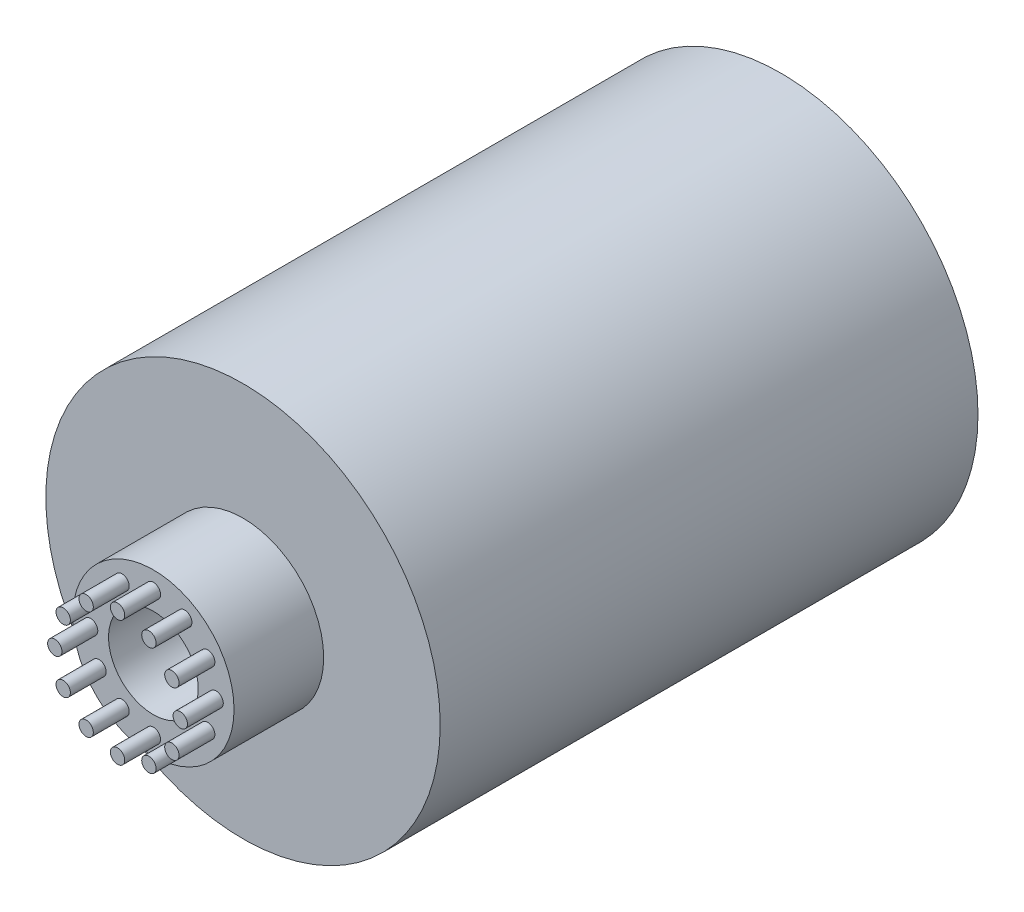
ISO-10303-21;
HEADER;
FILE_DESCRIPTION(('STEP AP214'),'2;1');
FILE_NAME('part.step','',(''),(''),'','','');
FILE_SCHEMA(('AUTOMOTIVE_DESIGN { 1 0 10303 214 1 1 1 1 }'));
ENDSEC;
DATA;
#1=APPLICATION_CONTEXT('core data for automotive mechanical design processes');
#2=APPLICATION_PROTOCOL_DEFINITION('international standard','automotive_design',2000,#1);
#3=PRODUCT_CONTEXT('',#1,'mechanical');
#4=PRODUCT('Part','Part','',(#3));
#5=PRODUCT_RELATED_PRODUCT_CATEGORY('part','',(#4));
#6=PRODUCT_DEFINITION_FORMATION('','',#4);
#7=PRODUCT_DEFINITION_CONTEXT('part definition',#1,'design');
#8=PRODUCT_DEFINITION('design','',#6,#7);
#9=PRODUCT_DEFINITION_SHAPE('','',#8);
#10=(LENGTH_UNIT() NAMED_UNIT(*) SI_UNIT(.MILLI.,.METRE.));
#11=(NAMED_UNIT(*) PLANE_ANGLE_UNIT() SI_UNIT($,.RADIAN.));
#12=(NAMED_UNIT(*) SI_UNIT($,.STERADIAN.) SOLID_ANGLE_UNIT());
#13=UNCERTAINTY_MEASURE_WITH_UNIT(LENGTH_MEASURE(1.E-05),#10,'distance_accuracy_value','');
#14=(GEOMETRIC_REPRESENTATION_CONTEXT(3) GLOBAL_UNCERTAINTY_ASSIGNED_CONTEXT((#13)) GLOBAL_UNIT_ASSIGNED_CONTEXT((#10,
#11,#12)) REPRESENTATION_CONTEXT('',''));
#15=CARTESIAN_POINT('',(0.,0.,0.));
#16=DIRECTION('',(0.,0.,1.));
#17=DIRECTION('',(1.,0.,0.));
#18=AXIS2_PLACEMENT_3D('',#15,#16,#17);
#19=CARTESIAN_POINT('',(0.,0.,30.));
#20=DIRECTION('',(0.,0.,-1.));
#21=DIRECTION('',(-1.,0.,0.));
#22=AXIS2_PLACEMENT_3D('',#19,#20,#21);
#23=CYLINDRICAL_SURFACE('',#22,11.);
#24=CARTESIAN_POINT('',(0.,0.,30.));
#25=DIRECTION('',(0.,0.,1.));
#26=DIRECTION('',(1.,0.,0.));
#27=AXIS2_PLACEMENT_3D('',#24,#25,#26);
#28=CIRCLE('',#27,11.);
#29=CARTESIAN_POINT('',(11.,0.,30.));
#30=VERTEX_POINT('',#29);
#31=EDGE_CURVE('E44',#30,#30,#28,.T.);
#32=ORIENTED_EDGE('',*,*,#31,.F.);
#33=EDGE_LOOP('',(#32));
#34=FACE_BOUND('',#33,.T.);
#35=CARTESIAN_POINT('',(0.,0.,0.));
#36=DIRECTION('',(0.,0.,1.));
#37=DIRECTION('',(1.,0.,0.));
#38=AXIS2_PLACEMENT_3D('',#35,#36,#37);
#39=CIRCLE('',#38,11.);
#40=CARTESIAN_POINT('',(11.,0.,0.));
#41=VERTEX_POINT('',#40);
#42=EDGE_CURVE('E35',#41,#41,#39,.T.);
#43=ORIENTED_EDGE('',*,*,#42,.T.);
#44=EDGE_LOOP('',(#43));
#45=FACE_BOUND('',#44,.T.);
#46=ADVANCED_FACE('F32',(#34,#45),#23,.T.);
#47=CARTESIAN_POINT('',(0.,0.,30.));
#48=DIRECTION('',(0.,0.,1.));
#49=DIRECTION('',(1.,0.,0.));
#50=AXIS2_PLACEMENT_3D('',#47,#48,#49);
#51=PLANE('',#50);
#52=CARTESIAN_POINT('',(0.,0.,30.));
#53=DIRECTION('',(0.,0.,1.));
#54=DIRECTION('',(1.,0.,0.));
#55=AXIS2_PLACEMENT_3D('',#52,#53,#54);
#56=CIRCLE('',#55,4.5);
#57=CARTESIAN_POINT('',(4.5,0.,30.));
#58=VERTEX_POINT('',#57);
#59=EDGE_CURVE('E39',#58,#58,#56,.T.);
#60=ORIENTED_EDGE('',*,*,#59,.F.);
#61=EDGE_LOOP('',(#60));
#62=FACE_BOUND('',#61,.T.);
#63=ORIENTED_EDGE('',*,*,#31,.T.);
#64=EDGE_LOOP('',(#63));
#65=FACE_BOUND('',#64,.T.);
#66=ADVANCED_FACE('F62',(#62,#65),#51,.T.);
#67=CARTESIAN_POINT('',(0.,0.,0.));
#68=DIRECTION('',(0.,0.,1.));
#69=DIRECTION('',(1.,0.,0.));
#70=AXIS2_PLACEMENT_3D('',#67,#68,#69);
#71=PLANE('',#70);
#72=CARTESIAN_POINT('',(0.,0.,0.));
#73=DIRECTION('',(0.,0.,-1.));
#74=DIRECTION('',(-1.,0.,0.));
#75=AXIS2_PLACEMENT_3D('',#72,#73,#74);
#76=CIRCLE('',#75,4.5);
#77=CARTESIAN_POINT('',(-4.5,0.,0.));
#78=VERTEX_POINT('',#77);
#79=EDGE_CURVE('E10',#78,#78,#76,.T.);
#80=ORIENTED_EDGE('',*,*,#79,.F.);
#81=EDGE_LOOP('',(#80));
#82=FACE_BOUND('',#81,.T.);
#83=ORIENTED_EDGE('',*,*,#42,.F.);
#84=EDGE_LOOP('',(#83));
#85=FACE_BOUND('',#84,.T.);
#86=ADVANCED_FACE('F59',(#82,#85),#71,.F.);
#87=CARTESIAN_POINT('',(0.,0.,35.));
#88=DIRECTION('',(0.,0.,-1.));
#89=DIRECTION('',(-1.,0.,0.));
#90=AXIS2_PLACEMENT_3D('',#87,#88,#89);
#91=CYLINDRICAL_SURFACE('',#90,4.5);
#92=CARTESIAN_POINT('',(0.,0.,35.));
#93=DIRECTION('',(0.,0.,1.));
#94=DIRECTION('',(1.,0.,0.));
#95=AXIS2_PLACEMENT_3D('',#92,#93,#94);
#96=CIRCLE('',#95,4.5);
#97=CARTESIAN_POINT('',(4.5,0.,35.));
#98=VERTEX_POINT('',#97);
#99=EDGE_CURVE('E50',#98,#98,#96,.T.);
#100=ORIENTED_EDGE('',*,*,#99,.F.);
#101=EDGE_LOOP('',(#100));
#102=FACE_BOUND('',#101,.T.);
#103=ORIENTED_EDGE('',*,*,#59,.T.);
#104=EDGE_LOOP('',(#103));
#105=FACE_BOUND('',#104,.T.);
#106=ADVANCED_FACE('F61',(#102,#105),#91,.T.);
#107=CARTESIAN_POINT('',(0.,0.,35.));
#108=DIRECTION('',(0.,0.,1.));
#109=DIRECTION('',(1.,0.,0.));
#110=AXIS2_PLACEMENT_3D('',#107,#108,#109);
#111=PLANE('',#110);
#112=CARTESIAN_POINT('',(1.74999999999996,3.03108891324556,35.));
#113=DIRECTION('',(0.,0.,1.));
#114=DIRECTION('',(0.866025403784445,-0.499999999999989,0.));
#115=AXIS2_PLACEMENT_3D('',#112,#113,#114);
#116=CIRCLE('',#115,0.4);
#117=CARTESIAN_POINT('',(2.09641016151374,2.83108891324556,35.));
#118=VERTEX_POINT('',#117);
#119=EDGE_CURVE('E392',#118,#118,#116,.T.);
#120=ORIENTED_EDGE('',*,*,#119,.F.);
#121=EDGE_LOOP('',(#120));
#122=FACE_BOUND('',#121,.T.);
#123=CARTESIAN_POINT('',(3.03108891324552,1.75000000000004,35.));
#124=DIRECTION('',(0.,0.,1.));
#125=DIRECTION('',(0.50000000000001,-0.866025403784433,0.));
#126=AXIS2_PLACEMENT_3D('',#123,#124,#125);
#127=CIRCLE('',#126,0.4);
#128=CARTESIAN_POINT('',(3.23108891324552,1.40358983848626,35.));
#129=VERTEX_POINT('',#128);
#130=EDGE_CURVE('E391',#129,#129,#127,.T.);
#131=ORIENTED_EDGE('',*,*,#130,.F.);
#132=EDGE_LOOP('',(#131));
#133=FACE_BOUND('',#132,.T.);
#134=CARTESIAN_POINT('',(3.5,0.,35.));
#135=DIRECTION('',(0.,0.,1.));
#136=DIRECTION('',(0.,-1.,0.));
#137=AXIS2_PLACEMENT_3D('',#134,#135,#136);
#138=CIRCLE('',#137,0.4);
#139=CARTESIAN_POINT('',(3.5,-0.399999999999963,35.));
#140=VERTEX_POINT('',#139);
#141=EDGE_CURVE('E401',#140,#140,#138,.T.);
#142=ORIENTED_EDGE('',*,*,#141,.F.);
#143=EDGE_LOOP('',(#142));
#144=FACE_BOUND('',#143,.T.);
#145=CARTESIAN_POINT('',(3.03108891324555,-1.74999999999997,35.));
#146=DIRECTION('',(0.,0.,1.));
#147=DIRECTION('',(-0.499999999999992,-0.866025403784443,0.));
#148=AXIS2_PLACEMENT_3D('',#145,#146,#147);
#149=CIRCLE('',#148,0.4);
#150=CARTESIAN_POINT('',(2.83108891324555,-2.09641016151375,35.));
#151=VERTEX_POINT('',#150);
#152=EDGE_CURVE('E406',#151,#151,#149,.T.);
#153=ORIENTED_EDGE('',*,*,#152,.F.);
#154=EDGE_LOOP('',(#153));
#155=FACE_BOUND('',#154,.T.);
#156=CARTESIAN_POINT('',(1.75000000000002,-3.03108891324552,35.));
#157=DIRECTION('',(0.,0.,1.));
#158=DIRECTION('',(-0.866025403784435,-0.500000000000007,0.));
#159=AXIS2_PLACEMENT_3D('',#156,#157,#158);
#160=CIRCLE('',#159,0.4);
#161=CARTESIAN_POINT('',(1.40358983848625,-3.23108891324552,35.));
#162=VERTEX_POINT('',#161);
#163=EDGE_CURVE('E412',#162,#162,#160,.T.);
#164=ORIENTED_EDGE('',*,*,#163,.F.);
#165=EDGE_LOOP('',(#164));
#166=FACE_BOUND('',#165,.T.);
#167=CARTESIAN_POINT('',(0.,-3.5,35.));
#168=DIRECTION('',(0.,0.,1.));
#169=DIRECTION('',(-1.,0.,0.));
#170=AXIS2_PLACEMENT_3D('',#167,#168,#169);
#171=CIRCLE('',#170,0.4);
#172=CARTESIAN_POINT('',(-0.4,-3.5,35.));
#173=VERTEX_POINT('',#172);
#174=EDGE_CURVE('E418',#173,#173,#171,.T.);
#175=ORIENTED_EDGE('',*,*,#174,.F.);
#176=EDGE_LOOP('',(#175));
#177=FACE_BOUND('',#176,.T.);
#178=CARTESIAN_POINT('',(-1.74999999999998,-3.03108891324555,35.));
#179=DIRECTION('',(0.,0.,1.));
#180=DIRECTION('',(-0.866025403784442,0.499999999999995,0.));
#181=AXIS2_PLACEMENT_3D('',#178,#179,#180);
#182=CIRCLE('',#181,0.4);
#183=CARTESIAN_POINT('',(-2.09641016151376,-2.83108891324555,35.));
#184=VERTEX_POINT('',#183);
#185=EDGE_CURVE('E424',#184,#184,#182,.T.);
#186=ORIENTED_EDGE('',*,*,#185,.F.);
#187=EDGE_LOOP('',(#186));
#188=FACE_BOUND('',#187,.T.);
#189=CARTESIAN_POINT('',(-3.03108891324553,-1.75000000000001,35.));
#190=DIRECTION('',(0.,0.,1.));
#191=DIRECTION('',(-0.500000000000004,0.866025403784436,0.));
#192=AXIS2_PLACEMENT_3D('',#189,#190,#191);
#193=CIRCLE('',#192,0.4);
#194=CARTESIAN_POINT('',(-3.23108891324553,-1.40358983848624,35.));
#195=VERTEX_POINT('',#194);
#196=EDGE_CURVE('E430',#195,#195,#193,.T.);
#197=ORIENTED_EDGE('',*,*,#196,.F.);
#198=EDGE_LOOP('',(#197));
#199=FACE_BOUND('',#198,.T.);
#200=CARTESIAN_POINT('',(-3.5,0.,35.));
#201=DIRECTION('',(0.,0.,1.));
#202=DIRECTION('',(0.,1.,0.));
#203=AXIS2_PLACEMENT_3D('',#200,#201,#202);
#204=CIRCLE('',#203,0.4);
#205=CARTESIAN_POINT('',(-3.5,0.399999999999988,35.));
#206=VERTEX_POINT('',#205);
#207=EDGE_CURVE('E436',#206,#206,#204,.T.);
#208=ORIENTED_EDGE('',*,*,#207,.F.);
#209=EDGE_LOOP('',(#208));
#210=FACE_BOUND('',#209,.T.);
#211=CARTESIAN_POINT('',(-3.03108891324554,1.74999999999999,35.));
#212=DIRECTION('',(0.,0.,1.));
#213=DIRECTION('',(0.499999999999998,0.86602540378444,0.));
#214=AXIS2_PLACEMENT_3D('',#211,#212,#213);
#215=CIRCLE('',#214,0.4);
#216=CARTESIAN_POINT('',(-2.83108891324554,2.09641016151377,35.));
#217=VERTEX_POINT('',#216);
#218=EDGE_CURVE('E442',#217,#217,#215,.T.);
#219=ORIENTED_EDGE('',*,*,#218,.F.);
#220=EDGE_LOOP('',(#219));
#221=FACE_BOUND('',#220,.T.);
#222=CARTESIAN_POINT('',(-1.75,3.03108891324553,35.));
#223=DIRECTION('',(0.,0.,1.));
#224=DIRECTION('',(0.866025403784438,0.500000000000001,0.));
#225=AXIS2_PLACEMENT_3D('',#222,#223,#224);
#226=CIRCLE('',#225,0.4);
#227=CARTESIAN_POINT('',(-1.40358983848623,3.23108891324553,35.));
#228=VERTEX_POINT('',#227);
#229=EDGE_CURVE('E448',#228,#228,#226,.T.);
#230=ORIENTED_EDGE('',*,*,#229,.F.);
#231=EDGE_LOOP('',(#230));
#232=FACE_BOUND('',#231,.T.);
#233=CARTESIAN_POINT('',(0.,3.5,35.));
#234=DIRECTION('',(0.,0.,1.));
#235=DIRECTION('',(1.,0.,0.));
#236=AXIS2_PLACEMENT_3D('',#233,#234,#235);
#237=CIRCLE('',#236,0.4);
#238=CARTESIAN_POINT('',(0.4,3.5,35.));
#239=VERTEX_POINT('',#238);
#240=EDGE_CURVE('E454',#239,#239,#237,.T.);
#241=ORIENTED_EDGE('',*,*,#240,.F.);
#242=EDGE_LOOP('',(#241));
#243=FACE_BOUND('',#242,.T.);
#244=CARTESIAN_POINT('',(0.,0.,35.));
#245=DIRECTION('',(0.,0.,1.));
#246=DIRECTION('',(1.,0.,0.));
#247=AXIS2_PLACEMENT_3D('',#244,#245,#246);
#248=CIRCLE('',#247,2.5);
#249=CARTESIAN_POINT('',(2.5,0.,35.));
#250=VERTEX_POINT('',#249);
#251=EDGE_CURVE('E460',#250,#250,#248,.T.);
#252=ORIENTED_EDGE('',*,*,#251,.F.);
#253=EDGE_LOOP('',(#252));
#254=FACE_BOUND('',#253,.T.);
#255=ORIENTED_EDGE('',*,*,#99,.T.);
#256=EDGE_LOOP('',(#255));
#257=FACE_BOUND('',#256,.T.);
#258=ADVANCED_FACE('F68',(#122,#133,#144,#155,#166,#177,#188,#199,#210,#221,#232,#243,#254,
#257),#111,.T.);
#259=CARTESIAN_POINT('',(0.,0.,-4.));
#260=DIRECTION('',(0.,0.,1.));
#261=DIRECTION('',(1.,0.,0.));
#262=AXIS2_PLACEMENT_3D('',#259,#260,#261);
#263=CYLINDRICAL_SURFACE('',#262,4.5);
#264=CARTESIAN_POINT('',(0.,0.,-4.));
#265=DIRECTION('',(0.,0.,-1.));
#266=DIRECTION('',(-1.,0.,0.));
#267=AXIS2_PLACEMENT_3D('',#264,#265,#266);
#268=CIRCLE('',#267,4.5);
#269=CARTESIAN_POINT('',(-4.5,0.,-4.));
#270=VERTEX_POINT('',#269);
#271=EDGE_CURVE('E48',#270,#270,#268,.T.);
#272=ORIENTED_EDGE('',*,*,#271,.F.);
#273=EDGE_LOOP('',(#272));
#274=FACE_BOUND('',#273,.T.);
#275=ORIENTED_EDGE('',*,*,#79,.T.);
#276=EDGE_LOOP('',(#275));
#277=FACE_BOUND('',#276,.T.);
#278=ADVANCED_FACE('F91',(#274,#277),#263,.T.);
#279=CARTESIAN_POINT('',(0.,0.,-4.));
#280=DIRECTION('',(0.,0.,-1.));
#281=DIRECTION('',(-1.,0.,0.));
#282=AXIS2_PLACEMENT_3D('',#279,#280,#281);
#283=PLANE('',#282);
#284=CARTESIAN_POINT('',(0.,0.,-4.));
#285=DIRECTION('',(0.,0.,1.));
#286=DIRECTION('',(1.,0.,0.));
#287=AXIS2_PLACEMENT_3D('',#284,#285,#286);
#288=CIRCLE('',#287,2.5);
#289=CARTESIAN_POINT('',(2.5,0.,-4.));
#290=VERTEX_POINT('',#289);
#291=EDGE_CURVE('E463',#290,#290,#288,.T.);
#292=ORIENTED_EDGE('',*,*,#291,.T.);
#293=EDGE_LOOP('',(#292));
#294=FACE_BOUND('',#293,.T.);
#295=ORIENTED_EDGE('',*,*,#271,.T.);
#296=EDGE_LOOP('',(#295));
#297=FACE_BOUND('',#296,.T.);
#298=ADVANCED_FACE('F112',(#294,#297),#283,.T.);
#299=CARTESIAN_POINT('',(0.,0.,-4.));
#300=DIRECTION('',(0.,0.,1.));
#301=DIRECTION('',(1.,0.,0.));
#302=AXIS2_PLACEMENT_3D('',#299,#300,#301);
#303=CYLINDRICAL_SURFACE('',#302,2.5);
#304=ORIENTED_EDGE('',*,*,#291,.F.);
#305=EDGE_LOOP('',(#304));
#306=FACE_BOUND('',#305,.T.);
#307=ORIENTED_EDGE('',*,*,#251,.T.);
#308=EDGE_LOOP('',(#307));
#309=FACE_BOUND('',#308,.T.);
#310=ADVANCED_FACE('F106',(#306,#309),#303,.F.);
#311=CARTESIAN_POINT('',(0.,3.5,37.));
#312=DIRECTION('',(0.,0.,-1.));
#313=DIRECTION('',(-1.,0.,0.));
#314=AXIS2_PLACEMENT_3D('',#311,#312,#313);
#315=CYLINDRICAL_SURFACE('',#314,0.4);
#316=CARTESIAN_POINT('',(0.,3.5,37.));
#317=DIRECTION('',(0.,0.,1.));
#318=DIRECTION('',(1.,0.,0.));
#319=AXIS2_PLACEMENT_3D('',#316,#317,#318);
#320=CIRCLE('',#319,0.4);
#321=CARTESIAN_POINT('',(0.4,3.5,37.));
#322=VERTEX_POINT('',#321);
#323=EDGE_CURVE('E457',#322,#322,#320,.T.);
#324=ORIENTED_EDGE('',*,*,#323,.F.);
#325=EDGE_LOOP('',(#324));
#326=FACE_BOUND('',#325,.T.);
#327=ORIENTED_EDGE('',*,*,#240,.T.);
#328=EDGE_LOOP('',(#327));
#329=FACE_BOUND('',#328,.T.);
#330=ADVANCED_FACE('F111',(#326,#329),#315,.T.);
#331=CARTESIAN_POINT('',(0.,3.5,37.));
#332=DIRECTION('',(0.,0.,1.));
#333=DIRECTION('',(1.,0.,0.));
#334=AXIS2_PLACEMENT_3D('',#331,#332,#333);
#335=PLANE('',#334);
#336=ORIENTED_EDGE('',*,*,#323,.T.);
#337=EDGE_LOOP('',(#336));
#338=FACE_BOUND('',#337,.T.);
#339=ADVANCED_FACE('F157',(#338),#335,.T.);
#340=CARTESIAN_POINT('',(-1.75,3.03108891324553,37.));
#341=DIRECTION('',(0.,0.,-1.));
#342=DIRECTION('',(-1.,0.,0.));
#343=AXIS2_PLACEMENT_3D('',#340,#341,#342);
#344=CYLINDRICAL_SURFACE('',#343,0.4);
#345=CARTESIAN_POINT('',(-1.75,3.03108891324553,37.));
#346=DIRECTION('',(0.,0.,1.));
#347=DIRECTION('',(0.866025403784438,0.500000000000001,0.));
#348=AXIS2_PLACEMENT_3D('',#345,#346,#347);
#349=CIRCLE('',#348,0.4);
#350=CARTESIAN_POINT('',(-1.40358983848623,3.23108891324553,37.));
#351=VERTEX_POINT('',#350);
#352=EDGE_CURVE('E451',#351,#351,#349,.T.);
#353=ORIENTED_EDGE('',*,*,#352,.F.);
#354=EDGE_LOOP('',(#353));
#355=FACE_BOUND('',#354,.T.);
#356=ORIENTED_EDGE('',*,*,#229,.T.);
#357=EDGE_LOOP('',(#356));
#358=FACE_BOUND('',#357,.T.);
#359=ADVANCED_FACE('F165',(#355,#358),#344,.T.);
#360=CARTESIAN_POINT('',(-1.75,3.03108891324553,37.));
#361=DIRECTION('',(0.,0.,1.));
#362=DIRECTION('',(0.866025403784438,0.500000000000001,0.));
#363=AXIS2_PLACEMENT_3D('',#360,#361,#362);
#364=PLANE('',#363);
#365=ORIENTED_EDGE('',*,*,#352,.T.);
#366=EDGE_LOOP('',(#365));
#367=FACE_BOUND('',#366,.T.);
#368=ADVANCED_FACE('F173',(#367),#364,.T.);
#369=CARTESIAN_POINT('',(-3.03108891324554,1.74999999999999,37.));
#370=DIRECTION('',(0.,0.,-1.));
#371=DIRECTION('',(-1.,0.,0.));
#372=AXIS2_PLACEMENT_3D('',#369,#370,#371);
#373=CYLINDRICAL_SURFACE('',#372,0.4);
#374=CARTESIAN_POINT('',(-3.03108891324554,1.74999999999999,37.));
#375=DIRECTION('',(0.,0.,1.));
#376=DIRECTION('',(0.499999999999998,0.86602540378444,0.));
#377=AXIS2_PLACEMENT_3D('',#374,#375,#376);
#378=CIRCLE('',#377,0.4);
#379=CARTESIAN_POINT('',(-2.83108891324554,2.09641016151377,37.));
#380=VERTEX_POINT('',#379);
#381=EDGE_CURVE('E445',#380,#380,#378,.T.);
#382=ORIENTED_EDGE('',*,*,#381,.F.);
#383=EDGE_LOOP('',(#382));
#384=FACE_BOUND('',#383,.T.);
#385=ORIENTED_EDGE('',*,*,#218,.T.);
#386=EDGE_LOOP('',(#385));
#387=FACE_BOUND('',#386,.T.);
#388=ADVANCED_FACE('F182',(#384,#387),#373,.T.);
#389=CARTESIAN_POINT('',(-3.03108891324554,1.74999999999999,37.));
#390=DIRECTION('',(0.,0.,1.));
#391=DIRECTION('',(0.499999999999998,0.86602540378444,0.));
#392=AXIS2_PLACEMENT_3D('',#389,#390,#391);
#393=PLANE('',#392);
#394=ORIENTED_EDGE('',*,*,#381,.T.);
#395=EDGE_LOOP('',(#394));
#396=FACE_BOUND('',#395,.T.);
#397=ADVANCED_FACE('F191',(#396),#393,.T.);
#398=CARTESIAN_POINT('',(-3.5,0.,37.));
#399=DIRECTION('',(0.,0.,-1.));
#400=DIRECTION('',(-1.,0.,0.));
#401=AXIS2_PLACEMENT_3D('',#398,#399,#400);
#402=CYLINDRICAL_SURFACE('',#401,0.4);
#403=CARTESIAN_POINT('',(-3.5,0.,37.));
#404=DIRECTION('',(0.,0.,1.));
#405=DIRECTION('',(0.,1.,0.));
#406=AXIS2_PLACEMENT_3D('',#403,#404,#405);
#407=CIRCLE('',#406,0.4);
#408=CARTESIAN_POINT('',(-3.5,0.399999999999988,37.));
#409=VERTEX_POINT('',#408);
#410=EDGE_CURVE('E439',#409,#409,#407,.T.);
#411=ORIENTED_EDGE('',*,*,#410,.F.);
#412=EDGE_LOOP('',(#411));
#413=FACE_BOUND('',#412,.T.);
#414=ORIENTED_EDGE('',*,*,#207,.T.);
#415=EDGE_LOOP('',(#414));
#416=FACE_BOUND('',#415,.T.);
#417=ADVANCED_FACE('F200',(#413,#416),#402,.T.);
#418=CARTESIAN_POINT('',(-3.5,0.,37.));
#419=DIRECTION('',(0.,0.,1.));
#420=DIRECTION('',(0.,1.,0.));
#421=AXIS2_PLACEMENT_3D('',#418,#419,#420);
#422=PLANE('',#421);
#423=ORIENTED_EDGE('',*,*,#410,.T.);
#424=EDGE_LOOP('',(#423));
#425=FACE_BOUND('',#424,.T.);
#426=ADVANCED_FACE('F209',(#425),#422,.T.);
#427=CARTESIAN_POINT('',(-3.03108891324553,-1.75000000000001,37.));
#428=DIRECTION('',(0.,0.,-1.));
#429=DIRECTION('',(-1.,0.,0.));
#430=AXIS2_PLACEMENT_3D('',#427,#428,#429);
#431=CYLINDRICAL_SURFACE('',#430,0.4);
#432=CARTESIAN_POINT('',(-3.03108891324553,-1.75000000000001,37.));
#433=DIRECTION('',(0.,0.,1.));
#434=DIRECTION('',(-0.500000000000004,0.866025403784436,0.));
#435=AXIS2_PLACEMENT_3D('',#432,#433,#434);
#436=CIRCLE('',#435,0.4);
#437=CARTESIAN_POINT('',(-3.23108891324553,-1.40358983848624,37.));
#438=VERTEX_POINT('',#437);
#439=EDGE_CURVE('E433',#438,#438,#436,.T.);
#440=ORIENTED_EDGE('',*,*,#439,.F.);
#441=EDGE_LOOP('',(#440));
#442=FACE_BOUND('',#441,.T.);
#443=ORIENTED_EDGE('',*,*,#196,.T.);
#444=EDGE_LOOP('',(#443));
#445=FACE_BOUND('',#444,.T.);
#446=ADVANCED_FACE('F218',(#442,#445),#431,.T.);
#447=CARTESIAN_POINT('',(-3.03108891324553,-1.75000000000001,37.));
#448=DIRECTION('',(0.,0.,1.));
#449=DIRECTION('',(-0.500000000000004,0.866025403784436,0.));
#450=AXIS2_PLACEMENT_3D('',#447,#448,#449);
#451=PLANE('',#450);
#452=ORIENTED_EDGE('',*,*,#439,.T.);
#453=EDGE_LOOP('',(#452));
#454=FACE_BOUND('',#453,.T.);
#455=ADVANCED_FACE('F227',(#454),#451,.T.);
#456=CARTESIAN_POINT('',(-1.74999999999998,-3.03108891324555,37.));
#457=DIRECTION('',(0.,0.,-1.));
#458=DIRECTION('',(-1.,0.,0.));
#459=AXIS2_PLACEMENT_3D('',#456,#457,#458);
#460=CYLINDRICAL_SURFACE('',#459,0.4);
#461=CARTESIAN_POINT('',(-1.74999999999998,-3.03108891324555,37.));
#462=DIRECTION('',(0.,0.,1.));
#463=DIRECTION('',(-0.866025403784442,0.499999999999995,0.));
#464=AXIS2_PLACEMENT_3D('',#461,#462,#463);
#465=CIRCLE('',#464,0.4);
#466=CARTESIAN_POINT('',(-2.09641016151376,-2.83108891324555,37.));
#467=VERTEX_POINT('',#466);
#468=EDGE_CURVE('E427',#467,#467,#465,.T.);
#469=ORIENTED_EDGE('',*,*,#468,.F.);
#470=EDGE_LOOP('',(#469));
#471=FACE_BOUND('',#470,.T.);
#472=ORIENTED_EDGE('',*,*,#185,.T.);
#473=EDGE_LOOP('',(#472));
#474=FACE_BOUND('',#473,.T.);
#475=ADVANCED_FACE('F236',(#471,#474),#460,.T.);
#476=CARTESIAN_POINT('',(-1.74999999999998,-3.03108891324555,37.));
#477=DIRECTION('',(0.,0.,1.));
#478=DIRECTION('',(-0.866025403784442,0.499999999999995,0.));
#479=AXIS2_PLACEMENT_3D('',#476,#477,#478);
#480=PLANE('',#479);
#481=ORIENTED_EDGE('',*,*,#468,.T.);
#482=EDGE_LOOP('',(#481));
#483=FACE_BOUND('',#482,.T.);
#484=ADVANCED_FACE('F245',(#483),#480,.T.);
#485=CARTESIAN_POINT('',(0.,-3.5,37.));
#486=DIRECTION('',(0.,0.,-1.));
#487=DIRECTION('',(-1.,0.,0.));
#488=AXIS2_PLACEMENT_3D('',#485,#486,#487);
#489=CYLINDRICAL_SURFACE('',#488,0.4);
#490=CARTESIAN_POINT('',(0.,-3.5,37.));
#491=DIRECTION('',(0.,0.,1.));
#492=DIRECTION('',(-1.,0.,0.));
#493=AXIS2_PLACEMENT_3D('',#490,#491,#492);
#494=CIRCLE('',#493,0.4);
#495=CARTESIAN_POINT('',(-0.4,-3.5,37.));
#496=VERTEX_POINT('',#495);
#497=EDGE_CURVE('E421',#496,#496,#494,.T.);
#498=ORIENTED_EDGE('',*,*,#497,.F.);
#499=EDGE_LOOP('',(#498));
#500=FACE_BOUND('',#499,.T.);
#501=ORIENTED_EDGE('',*,*,#174,.T.);
#502=EDGE_LOOP('',(#501));
#503=FACE_BOUND('',#502,.T.);
#504=ADVANCED_FACE('F254',(#500,#503),#489,.T.);
#505=CARTESIAN_POINT('',(0.,-3.5,37.));
#506=DIRECTION('',(0.,0.,1.));
#507=DIRECTION('',(-1.,0.,0.));
#508=AXIS2_PLACEMENT_3D('',#505,#506,#507);
#509=PLANE('',#508);
#510=ORIENTED_EDGE('',*,*,#497,.T.);
#511=EDGE_LOOP('',(#510));
#512=FACE_BOUND('',#511,.T.);
#513=ADVANCED_FACE('F263',(#512),#509,.T.);
#514=CARTESIAN_POINT('',(1.75000000000002,-3.03108891324552,37.));
#515=DIRECTION('',(0.,0.,-1.));
#516=DIRECTION('',(-1.,0.,0.));
#517=AXIS2_PLACEMENT_3D('',#514,#515,#516);
#518=CYLINDRICAL_SURFACE('',#517,0.4);
#519=CARTESIAN_POINT('',(1.75000000000002,-3.03108891324552,37.));
#520=DIRECTION('',(0.,0.,1.));
#521=DIRECTION('',(-0.866025403784435,-0.500000000000007,0.));
#522=AXIS2_PLACEMENT_3D('',#519,#520,#521);
#523=CIRCLE('',#522,0.4);
#524=CARTESIAN_POINT('',(1.40358983848625,-3.23108891324552,37.));
#525=VERTEX_POINT('',#524);
#526=EDGE_CURVE('E415',#525,#525,#523,.T.);
#527=ORIENTED_EDGE('',*,*,#526,.F.);
#528=EDGE_LOOP('',(#527));
#529=FACE_BOUND('',#528,.T.);
#530=ORIENTED_EDGE('',*,*,#163,.T.);
#531=EDGE_LOOP('',(#530));
#532=FACE_BOUND('',#531,.T.);
#533=ADVANCED_FACE('F272',(#529,#532),#518,.T.);
#534=CARTESIAN_POINT('',(1.75000000000002,-3.03108891324552,37.));
#535=DIRECTION('',(0.,0.,1.));
#536=DIRECTION('',(-0.866025403784435,-0.500000000000007,0.));
#537=AXIS2_PLACEMENT_3D('',#534,#535,#536);
#538=PLANE('',#537);
#539=ORIENTED_EDGE('',*,*,#526,.T.);
#540=EDGE_LOOP('',(#539));
#541=FACE_BOUND('',#540,.T.);
#542=ADVANCED_FACE('F281',(#541),#538,.T.);
#543=CARTESIAN_POINT('',(3.03108891324555,-1.74999999999997,37.));
#544=DIRECTION('',(0.,0.,-1.));
#545=DIRECTION('',(-1.,0.,0.));
#546=AXIS2_PLACEMENT_3D('',#543,#544,#545);
#547=CYLINDRICAL_SURFACE('',#546,0.4);
#548=CARTESIAN_POINT('',(3.03108891324555,-1.74999999999997,37.));
#549=DIRECTION('',(0.,0.,1.));
#550=DIRECTION('',(-0.499999999999992,-0.866025403784443,0.));
#551=AXIS2_PLACEMENT_3D('',#548,#549,#550);
#552=CIRCLE('',#551,0.4);
#553=CARTESIAN_POINT('',(2.83108891324555,-2.09641016151375,37.));
#554=VERTEX_POINT('',#553);
#555=EDGE_CURVE('E409',#554,#554,#552,.T.);
#556=ORIENTED_EDGE('',*,*,#555,.F.);
#557=EDGE_LOOP('',(#556));
#558=FACE_BOUND('',#557,.T.);
#559=ORIENTED_EDGE('',*,*,#152,.T.);
#560=EDGE_LOOP('',(#559));
#561=FACE_BOUND('',#560,.T.);
#562=ADVANCED_FACE('F290',(#558,#561),#547,.T.);
#563=CARTESIAN_POINT('',(3.03108891324555,-1.74999999999997,37.));
#564=DIRECTION('',(0.,0.,1.));
#565=DIRECTION('',(-0.499999999999992,-0.866025403784443,0.));
#566=AXIS2_PLACEMENT_3D('',#563,#564,#565);
#567=PLANE('',#566);
#568=ORIENTED_EDGE('',*,*,#555,.T.);
#569=EDGE_LOOP('',(#568));
#570=FACE_BOUND('',#569,.T.);
#571=ADVANCED_FACE('F299',(#570),#567,.T.);
#572=CARTESIAN_POINT('',(3.5,0.,37.));
#573=DIRECTION('',(0.,0.,-1.));
#574=DIRECTION('',(-1.,0.,0.));
#575=AXIS2_PLACEMENT_3D('',#572,#573,#574);
#576=CYLINDRICAL_SURFACE('',#575,0.4);
#577=CARTESIAN_POINT('',(3.5,0.,37.));
#578=DIRECTION('',(0.,0.,1.));
#579=DIRECTION('',(0.,-1.,0.));
#580=AXIS2_PLACEMENT_3D('',#577,#578,#579);
#581=CIRCLE('',#580,0.4);
#582=CARTESIAN_POINT('',(3.5,-0.399999999999963,37.));
#583=VERTEX_POINT('',#582);
#584=EDGE_CURVE('E403',#583,#583,#581,.T.);
#585=ORIENTED_EDGE('',*,*,#584,.F.);
#586=EDGE_LOOP('',(#585));
#587=FACE_BOUND('',#586,.T.);
#588=ORIENTED_EDGE('',*,*,#141,.T.);
#589=EDGE_LOOP('',(#588));
#590=FACE_BOUND('',#589,.T.);
#591=ADVANCED_FACE('F308',(#587,#590),#576,.T.);
#592=CARTESIAN_POINT('',(3.5,0.,37.));
#593=DIRECTION('',(0.,0.,1.));
#594=DIRECTION('',(0.,-1.,0.));
#595=AXIS2_PLACEMENT_3D('',#592,#593,#594);
#596=PLANE('',#595);
#597=ORIENTED_EDGE('',*,*,#584,.T.);
#598=EDGE_LOOP('',(#597));
#599=FACE_BOUND('',#598,.T.);
#600=ADVANCED_FACE('F317',(#599),#596,.T.);
#601=CARTESIAN_POINT('',(3.03108891324552,1.75000000000004,37.));
#602=DIRECTION('',(0.,0.,-1.));
#603=DIRECTION('',(-1.,0.,0.));
#604=AXIS2_PLACEMENT_3D('',#601,#602,#603);
#605=CYLINDRICAL_SURFACE('',#604,0.4);
#606=CARTESIAN_POINT('',(3.03108891324552,1.75000000000004,37.));
#607=DIRECTION('',(0.,0.,1.));
#608=DIRECTION('',(0.50000000000001,-0.866025403784433,0.));
#609=AXIS2_PLACEMENT_3D('',#606,#607,#608);
#610=CIRCLE('',#609,0.4);
#611=CARTESIAN_POINT('',(3.23108891324552,1.40358983848626,37.));
#612=VERTEX_POINT('',#611);
#613=EDGE_CURVE('E395',#612,#612,#610,.T.);
#614=ORIENTED_EDGE('',*,*,#613,.F.);
#615=EDGE_LOOP('',(#614));
#616=FACE_BOUND('',#615,.T.);
#617=ORIENTED_EDGE('',*,*,#130,.T.);
#618=EDGE_LOOP('',(#617));
#619=FACE_BOUND('',#618,.T.);
#620=ADVANCED_FACE('F326',(#616,#619),#605,.T.);
#621=CARTESIAN_POINT('',(3.03108891324552,1.75000000000004,37.));
#622=DIRECTION('',(0.,0.,1.));
#623=DIRECTION('',(0.50000000000001,-0.866025403784433,0.));
#624=AXIS2_PLACEMENT_3D('',#621,#622,#623);
#625=PLANE('',#624);
#626=ORIENTED_EDGE('',*,*,#613,.T.);
#627=EDGE_LOOP('',(#626));
#628=FACE_BOUND('',#627,.T.);
#629=ADVANCED_FACE('F335',(#628),#625,.T.);
#630=CARTESIAN_POINT('',(1.74999999999996,3.03108891324556,37.));
#631=DIRECTION('',(0.,0.,-1.));
#632=DIRECTION('',(-1.,0.,0.));
#633=AXIS2_PLACEMENT_3D('',#630,#631,#632);
#634=CYLINDRICAL_SURFACE('',#633,0.4);
#635=CARTESIAN_POINT('',(1.74999999999996,3.03108891324556,37.));
#636=DIRECTION('',(0.,0.,1.));
#637=DIRECTION('',(0.866025403784445,-0.499999999999989,0.));
#638=AXIS2_PLACEMENT_3D('',#635,#636,#637);
#639=CIRCLE('',#638,0.4);
#640=CARTESIAN_POINT('',(2.09641016151374,2.83108891324556,37.));
#641=VERTEX_POINT('',#640);
#642=EDGE_CURVE('E390',#641,#641,#639,.T.);
#643=ORIENTED_EDGE('',*,*,#642,.F.);
#644=EDGE_LOOP('',(#643));
#645=FACE_BOUND('',#644,.T.);
#646=ORIENTED_EDGE('',*,*,#119,.T.);
#647=EDGE_LOOP('',(#646));
#648=FACE_BOUND('',#647,.T.);
#649=ADVANCED_FACE('F344',(#645,#648),#634,.T.);
#650=CARTESIAN_POINT('',(1.74999999999996,3.03108891324556,37.));
#651=DIRECTION('',(0.,0.,1.));
#652=DIRECTION('',(0.866025403784445,-0.499999999999989,0.));
#653=AXIS2_PLACEMENT_3D('',#650,#651,#652);
#654=PLANE('',#653);
#655=ORIENTED_EDGE('',*,*,#642,.T.);
#656=EDGE_LOOP('',(#655));
#657=FACE_BOUND('',#656,.T.);
#658=ADVANCED_FACE('F353',(#657),#654,.T.);
#659=CLOSED_SHELL('',(#46,#66,#86,#106,#258,#278,#298,#310,#330,#339,#359,#368,#388,#397,#417,
#426,#446,#455,#475,#484,#504,#513,#533,#542,#562,#571,#591,#600,#620,#629,#649,#658));
#660=MANIFOLD_SOLID_BREP('B2',#659);
#661=ADVANCED_BREP_SHAPE_REPRESENTATION('',(#18,#660),#14);
#662=SHAPE_DEFINITION_REPRESENTATION(#9,#661);
ENDSEC;
END-ISO-10303-21;
